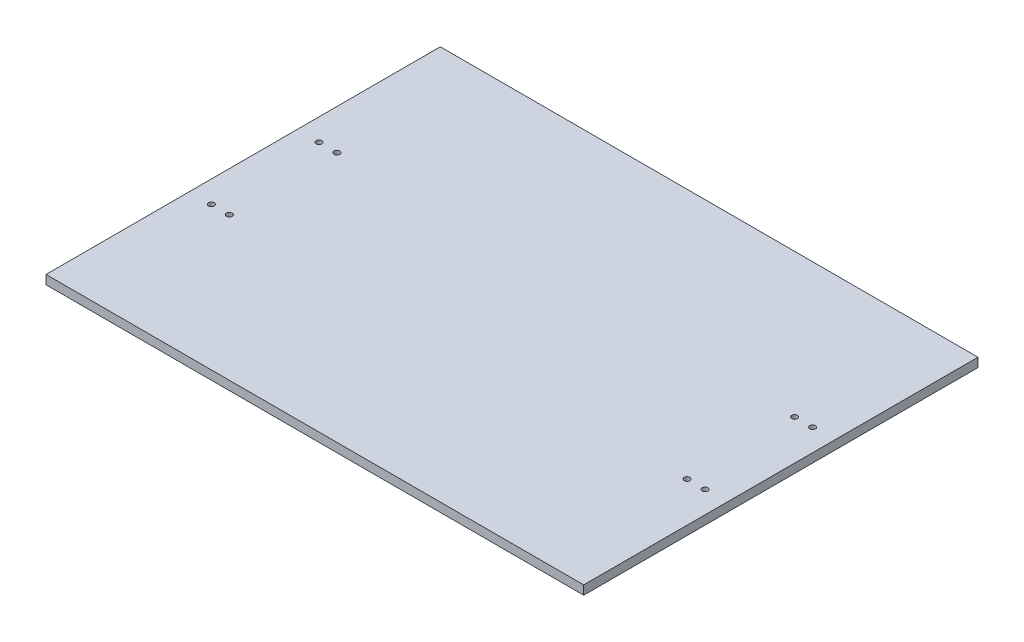
ISO-10303-21;
HEADER;
FILE_DESCRIPTION(('STEP AP214'),'2;1');
FILE_NAME('part.step','',(''),(''),'','','');
FILE_SCHEMA(('AUTOMOTIVE_DESIGN { 1 0 10303 214 1 1 1 1 }'));
ENDSEC;
DATA;
#1=APPLICATION_CONTEXT('core data for automotive mechanical design processes');
#2=APPLICATION_PROTOCOL_DEFINITION('international standard','automotive_design',2000,#1);
#3=PRODUCT_CONTEXT('',#1,'mechanical');
#4=PRODUCT('Part','Part','',(#3));
#5=PRODUCT_RELATED_PRODUCT_CATEGORY('part','',(#4));
#6=PRODUCT_DEFINITION_FORMATION('','',#4);
#7=PRODUCT_DEFINITION_CONTEXT('part definition',#1,'design');
#8=PRODUCT_DEFINITION('design','',#6,#7);
#9=PRODUCT_DEFINITION_SHAPE('','',#8);
#10=(LENGTH_UNIT() NAMED_UNIT(*) SI_UNIT(.MILLI.,.METRE.));
#11=(NAMED_UNIT(*) PLANE_ANGLE_UNIT() SI_UNIT($,.RADIAN.));
#12=(NAMED_UNIT(*) SI_UNIT($,.STERADIAN.) SOLID_ANGLE_UNIT());
#13=UNCERTAINTY_MEASURE_WITH_UNIT(LENGTH_MEASURE(1.E-05),#10,'distance_accuracy_value','');
#14=(GEOMETRIC_REPRESENTATION_CONTEXT(3) GLOBAL_UNCERTAINTY_ASSIGNED_CONTEXT((#13)) GLOBAL_UNIT_ASSIGNED_CONTEXT((#10,
#11,#12)) REPRESENTATION_CONTEXT('',''));
#15=CARTESIAN_POINT('',(0.,0.,0.));
#16=DIRECTION('',(0.,0.,1.));
#17=DIRECTION('',(1.,0.,0.));
#18=AXIS2_PLACEMENT_3D('',#15,#16,#17);
#19=CARTESIAN_POINT('',(-150.,5.,-110.));
#20=DIRECTION('',(1.,0.,0.));
#21=DIRECTION('',(0.,0.,-1.));
#22=AXIS2_PLACEMENT_3D('',#19,#20,#21);
#23=PLANE('',#22);
#24=DIRECTION('',(0.,0.,1.));
#25=VECTOR('',#24,1.);
#26=CARTESIAN_POINT('',(-150.,0.,-110.));
#27=LINE('',#26,#25);
#28=CARTESIAN_POINT('',(-150.,0.,-110.));
#29=VERTEX_POINT('',#28);
#30=CARTESIAN_POINT('',(-150.,0.,110.));
#31=VERTEX_POINT('',#30);
#32=EDGE_CURVE('E100',#29,#31,#27,.T.);
#33=ORIENTED_EDGE('',*,*,#32,.T.);
#34=DIRECTION('',(0.,-1.,0.));
#35=VECTOR('',#34,1.);
#36=CARTESIAN_POINT('',(-150.,5.,110.));
#37=LINE('',#36,#35);
#38=CARTESIAN_POINT('',(-150.,5.,110.));
#39=VERTEX_POINT('',#38);
#40=EDGE_CURVE('E11',#39,#31,#37,.T.);
#41=ORIENTED_EDGE('',*,*,#40,.F.);
#42=DIRECTION('',(0.,0.,1.));
#43=VECTOR('',#42,1.);
#44=CARTESIAN_POINT('',(-150.,5.,-110.));
#45=LINE('',#44,#43);
#46=CARTESIAN_POINT('',(-150.,5.,-110.));
#47=VERTEX_POINT('',#46);
#48=EDGE_CURVE('E88',#47,#39,#45,.T.);
#49=ORIENTED_EDGE('',*,*,#48,.F.);
#50=DIRECTION('',(0.,-1.,0.));
#51=VECTOR('',#50,1.);
#52=CARTESIAN_POINT('',(-150.,5.,-110.));
#53=LINE('',#52,#51);
#54=EDGE_CURVE('E96',#47,#29,#53,.T.);
#55=ORIENTED_EDGE('',*,*,#54,.T.);
#56=EDGE_LOOP('',(#33,#41,#49,#55));
#57=FACE_BOUND('',#56,.T.);
#58=ADVANCED_FACE('F37',(#57),#23,.F.);
#59=CARTESIAN_POINT('',(-150.,5.,110.));
#60=DIRECTION('',(0.,0.,-1.));
#61=DIRECTION('',(-1.,0.,0.));
#62=AXIS2_PLACEMENT_3D('',#59,#60,#61);
#63=PLANE('',#62);
#64=DIRECTION('',(1.,0.,0.));
#65=VECTOR('',#64,1.);
#66=CARTESIAN_POINT('',(-150.,0.,110.));
#67=LINE('',#66,#65);
#68=CARTESIAN_POINT('',(150.,0.,110.));
#69=VERTEX_POINT('',#68);
#70=EDGE_CURVE('E92',#31,#69,#67,.T.);
#71=ORIENTED_EDGE('',*,*,#70,.T.);
#72=DIRECTION('',(0.,-1.,0.));
#73=VECTOR('',#72,1.);
#74=CARTESIAN_POINT('',(150.,5.,110.));
#75=LINE('',#74,#73);
#76=CARTESIAN_POINT('',(150.,5.,110.));
#77=VERTEX_POINT('',#76);
#78=EDGE_CURVE('E45',#77,#69,#75,.T.);
#79=ORIENTED_EDGE('',*,*,#78,.F.);
#80=DIRECTION('',(1.,0.,0.));
#81=VECTOR('',#80,1.);
#82=CARTESIAN_POINT('',(-150.,5.,110.));
#83=LINE('',#82,#81);
#84=EDGE_CURVE('E83',#39,#77,#83,.T.);
#85=ORIENTED_EDGE('',*,*,#84,.F.);
#86=ORIENTED_EDGE('',*,*,#40,.T.);
#87=EDGE_LOOP('',(#71,#79,#85,#86));
#88=FACE_BOUND('',#87,.T.);
#89=ADVANCED_FACE('F91',(#88),#63,.F.);
#90=CARTESIAN_POINT('',(150.,5.,-110.));
#91=DIRECTION('',(-1.,0.,0.));
#92=DIRECTION('',(0.,0.,1.));
#93=AXIS2_PLACEMENT_3D('',#90,#91,#92);
#94=PLANE('',#93);
#95=DIRECTION('',(0.,0.,-1.));
#96=VECTOR('',#95,1.);
#97=CARTESIAN_POINT('',(150.,0.,-110.));
#98=LINE('',#97,#96);
#99=CARTESIAN_POINT('',(150.,0.,-110.));
#100=VERTEX_POINT('',#99);
#101=EDGE_CURVE('E70',#69,#100,#98,.T.);
#102=ORIENTED_EDGE('',*,*,#101,.T.);
#103=DIRECTION('',(0.,-1.,0.));
#104=VECTOR('',#103,1.);
#105=CARTESIAN_POINT('',(150.,5.,-110.));
#106=LINE('',#105,#104);
#107=CARTESIAN_POINT('',(150.,5.,-110.));
#108=VERTEX_POINT('',#107);
#109=EDGE_CURVE('E93',#108,#100,#106,.T.);
#110=ORIENTED_EDGE('',*,*,#109,.F.);
#111=DIRECTION('',(0.,0.,-1.));
#112=VECTOR('',#111,1.);
#113=CARTESIAN_POINT('',(150.,5.,-110.));
#114=LINE('',#113,#112);
#115=EDGE_CURVE('E86',#77,#108,#114,.T.);
#116=ORIENTED_EDGE('',*,*,#115,.F.);
#117=ORIENTED_EDGE('',*,*,#78,.T.);
#118=EDGE_LOOP('',(#102,#110,#116,#117));
#119=FACE_BOUND('',#118,.T.);
#120=ADVANCED_FACE('F94',(#119),#94,.F.);
#121=CARTESIAN_POINT('',(-150.,5.,-110.));
#122=DIRECTION('',(0.,0.,1.));
#123=DIRECTION('',(1.,0.,0.));
#124=AXIS2_PLACEMENT_3D('',#121,#122,#123);
#125=PLANE('',#124);
#126=DIRECTION('',(-1.,0.,0.));
#127=VECTOR('',#126,1.);
#128=CARTESIAN_POINT('',(-150.,0.,-110.));
#129=LINE('',#128,#127);
#130=EDGE_CURVE('E76',#100,#29,#129,.T.);
#131=ORIENTED_EDGE('',*,*,#130,.T.);
#132=ORIENTED_EDGE('',*,*,#54,.F.);
#133=DIRECTION('',(-1.,0.,0.));
#134=VECTOR('',#133,1.);
#135=CARTESIAN_POINT('',(-150.,5.,-110.));
#136=LINE('',#135,#134);
#137=EDGE_CURVE('E53',#108,#47,#136,.T.);
#138=ORIENTED_EDGE('',*,*,#137,.F.);
#139=ORIENTED_EDGE('',*,*,#109,.T.);
#140=EDGE_LOOP('',(#131,#132,#138,#139));
#141=FACE_BOUND('',#140,.T.);
#142=ADVANCED_FACE('F108',(#141),#125,.F.);
#143=CARTESIAN_POINT('',(0.,5.,0.));
#144=DIRECTION('',(0.,1.,0.));
#145=DIRECTION('',(0.,0.,1.));
#146=AXIS2_PLACEMENT_3D('',#143,#144,#145);
#147=PLANE('',#146);
#148=CARTESIAN_POINT('',(137.7,5.,30.));
#149=DIRECTION('',(0.,1.,0.));
#150=DIRECTION('',(0.,0.,1.));
#151=AXIS2_PLACEMENT_3D('',#148,#149,#150);
#152=CIRCLE('',#151,1.59999999999999);
#153=CARTESIAN_POINT('',(137.7,5.,31.6));
#154=VERTEX_POINT('',#153);
#155=EDGE_CURVE('E103',#154,#154,#152,.T.);
#156=ORIENTED_EDGE('',*,*,#155,.F.);
#157=EDGE_LOOP('',(#156));
#158=FACE_BOUND('',#157,.T.);
#159=CARTESIAN_POINT('',(-127.7,5.,30.));
#160=DIRECTION('',(0.,1.,0.));
#161=DIRECTION('',(0.,0.,1.));
#162=AXIS2_PLACEMENT_3D('',#159,#160,#161);
#163=CIRCLE('',#162,1.60000000000002);
#164=CARTESIAN_POINT('',(-127.7,5.,31.6));
#165=VERTEX_POINT('',#164);
#166=EDGE_CURVE('E116',#165,#165,#163,.T.);
#167=ORIENTED_EDGE('',*,*,#166,.F.);
#168=EDGE_LOOP('',(#167));
#169=FACE_BOUND('',#168,.T.);
#170=CARTESIAN_POINT('',(-137.7,5.,30.));
#171=DIRECTION('',(0.,1.,0.));
#172=DIRECTION('',(0.,0.,1.));
#173=AXIS2_PLACEMENT_3D('',#170,#171,#172);
#174=CIRCLE('',#173,1.60000000000002);
#175=CARTESIAN_POINT('',(-137.7,5.,31.6));
#176=VERTEX_POINT('',#175);
#177=EDGE_CURVE('E119',#176,#176,#174,.T.);
#178=ORIENTED_EDGE('',*,*,#177,.F.);
#179=EDGE_LOOP('',(#178));
#180=FACE_BOUND('',#179,.T.);
#181=CARTESIAN_POINT('',(-127.7,5.,-30.));
#182=DIRECTION('',(0.,1.,0.));
#183=DIRECTION('',(0.,0.,1.));
#184=AXIS2_PLACEMENT_3D('',#181,#182,#183);
#185=CIRCLE('',#184,1.60000000000002);
#186=CARTESIAN_POINT('',(-127.7,5.,-28.4));
#187=VERTEX_POINT('',#186);
#188=EDGE_CURVE('E122',#187,#187,#185,.T.);
#189=ORIENTED_EDGE('',*,*,#188,.F.);
#190=EDGE_LOOP('',(#189));
#191=FACE_BOUND('',#190,.T.);
#192=CARTESIAN_POINT('',(137.7,5.,-30.));
#193=DIRECTION('',(0.,1.,0.));
#194=DIRECTION('',(0.,0.,1.));
#195=AXIS2_PLACEMENT_3D('',#192,#193,#194);
#196=CIRCLE('',#195,1.59999999999999);
#197=CARTESIAN_POINT('',(137.7,5.,-28.4));
#198=VERTEX_POINT('',#197);
#199=EDGE_CURVE('E125',#198,#198,#196,.T.);
#200=ORIENTED_EDGE('',*,*,#199,.F.);
#201=EDGE_LOOP('',(#200));
#202=FACE_BOUND('',#201,.T.);
#203=CARTESIAN_POINT('',(127.7,5.,-30.));
#204=DIRECTION('',(0.,1.,0.));
#205=DIRECTION('',(0.,0.,1.));
#206=AXIS2_PLACEMENT_3D('',#203,#204,#205);
#207=CIRCLE('',#206,1.60000000000002);
#208=CARTESIAN_POINT('',(127.7,5.,-28.4));
#209=VERTEX_POINT('',#208);
#210=EDGE_CURVE('E128',#209,#209,#207,.T.);
#211=ORIENTED_EDGE('',*,*,#210,.F.);
#212=EDGE_LOOP('',(#211));
#213=FACE_BOUND('',#212,.T.);
#214=CARTESIAN_POINT('',(127.7,5.,30.));
#215=DIRECTION('',(0.,1.,0.));
#216=DIRECTION('',(0.,0.,1.));
#217=AXIS2_PLACEMENT_3D('',#214,#215,#216);
#218=CIRCLE('',#217,1.60000000000002);
#219=CARTESIAN_POINT('',(127.7,5.,31.6));
#220=VERTEX_POINT('',#219);
#221=EDGE_CURVE('E131',#220,#220,#218,.T.);
#222=ORIENTED_EDGE('',*,*,#221,.F.);
#223=EDGE_LOOP('',(#222));
#224=FACE_BOUND('',#223,.T.);
#225=CARTESIAN_POINT('',(-137.7,5.,-30.));
#226=DIRECTION('',(0.,1.,0.));
#227=DIRECTION('',(0.,0.,1.));
#228=AXIS2_PLACEMENT_3D('',#225,#226,#227);
#229=CIRCLE('',#228,1.60000000000002);
#230=CARTESIAN_POINT('',(-137.7,5.,-28.4));
#231=VERTEX_POINT('',#230);
#232=EDGE_CURVE('E134',#231,#231,#229,.T.);
#233=ORIENTED_EDGE('',*,*,#232,.F.);
#234=EDGE_LOOP('',(#233));
#235=FACE_BOUND('',#234,.T.);
#236=ORIENTED_EDGE('',*,*,#48,.T.);
#237=ORIENTED_EDGE('',*,*,#84,.T.);
#238=ORIENTED_EDGE('',*,*,#115,.T.);
#239=ORIENTED_EDGE('',*,*,#137,.T.);
#240=EDGE_LOOP('',(#236,#237,#238,#239));
#241=FACE_BOUND('',#240,.T.);
#242=ADVANCED_FACE('F84',(#158,#169,#180,#191,#202,#213,#224,#235,#241),#147,.T.);
#243=CARTESIAN_POINT('',(0.,0.,0.));
#244=DIRECTION('',(0.,1.,0.));
#245=DIRECTION('',(0.,0.,1.));
#246=AXIS2_PLACEMENT_3D('',#243,#244,#245);
#247=PLANE('',#246);
#248=CARTESIAN_POINT('',(137.7,0.,30.));
#249=DIRECTION('',(0.,-1.,0.));
#250=DIRECTION('',(0.,0.,-1.));
#251=AXIS2_PLACEMENT_3D('',#248,#249,#250);
#252=CIRCLE('',#251,1.59999999999999);
#253=CARTESIAN_POINT('',(137.7,0.,28.4));
#254=VERTEX_POINT('',#253);
#255=EDGE_CURVE('E147',#254,#254,#252,.T.);
#256=ORIENTED_EDGE('',*,*,#255,.F.);
#257=EDGE_LOOP('',(#256));
#258=FACE_BOUND('',#257,.T.);
#259=CARTESIAN_POINT('',(-127.7,0.,30.));
#260=DIRECTION('',(0.,-1.,0.));
#261=DIRECTION('',(0.,0.,-1.));
#262=AXIS2_PLACEMENT_3D('',#259,#260,#261);
#263=CIRCLE('',#262,1.60000000000002);
#264=CARTESIAN_POINT('',(-127.7,0.,28.4));
#265=VERTEX_POINT('',#264);
#266=EDGE_CURVE('E144',#265,#265,#263,.T.);
#267=ORIENTED_EDGE('',*,*,#266,.F.);
#268=EDGE_LOOP('',(#267));
#269=FACE_BOUND('',#268,.T.);
#270=CARTESIAN_POINT('',(-137.7,0.,30.));
#271=DIRECTION('',(0.,-1.,0.));
#272=DIRECTION('',(0.,0.,-1.));
#273=AXIS2_PLACEMENT_3D('',#270,#271,#272);
#274=CIRCLE('',#273,1.60000000000002);
#275=CARTESIAN_POINT('',(-137.7,0.,28.4));
#276=VERTEX_POINT('',#275);
#277=EDGE_CURVE('E141',#276,#276,#274,.T.);
#278=ORIENTED_EDGE('',*,*,#277,.F.);
#279=EDGE_LOOP('',(#278));
#280=FACE_BOUND('',#279,.T.);
#281=CARTESIAN_POINT('',(-127.7,0.,-30.));
#282=DIRECTION('',(0.,-1.,0.));
#283=DIRECTION('',(0.,0.,-1.));
#284=AXIS2_PLACEMENT_3D('',#281,#282,#283);
#285=CIRCLE('',#284,1.60000000000002);
#286=CARTESIAN_POINT('',(-127.7,0.,-31.6));
#287=VERTEX_POINT('',#286);
#288=EDGE_CURVE('E140',#287,#287,#285,.T.);
#289=ORIENTED_EDGE('',*,*,#288,.F.);
#290=EDGE_LOOP('',(#289));
#291=FACE_BOUND('',#290,.T.);
#292=CARTESIAN_POINT('',(137.7,0.,-30.));
#293=DIRECTION('',(0.,-1.,0.));
#294=DIRECTION('',(0.,0.,-1.));
#295=AXIS2_PLACEMENT_3D('',#292,#293,#294);
#296=CIRCLE('',#295,1.59999999999999);
#297=CARTESIAN_POINT('',(137.7,0.,-31.6));
#298=VERTEX_POINT('',#297);
#299=EDGE_CURVE('E150',#298,#298,#296,.T.);
#300=ORIENTED_EDGE('',*,*,#299,.F.);
#301=EDGE_LOOP('',(#300));
#302=FACE_BOUND('',#301,.T.);
#303=CARTESIAN_POINT('',(127.7,0.,-30.));
#304=DIRECTION('',(0.,-1.,0.));
#305=DIRECTION('',(0.,0.,-1.));
#306=AXIS2_PLACEMENT_3D('',#303,#304,#305);
#307=CIRCLE('',#306,1.60000000000002);
#308=CARTESIAN_POINT('',(127.7,0.,-31.6));
#309=VERTEX_POINT('',#308);
#310=EDGE_CURVE('E156',#309,#309,#307,.T.);
#311=ORIENTED_EDGE('',*,*,#310,.F.);
#312=EDGE_LOOP('',(#311));
#313=FACE_BOUND('',#312,.T.);
#314=CARTESIAN_POINT('',(127.7,0.,30.));
#315=DIRECTION('',(0.,-1.,0.));
#316=DIRECTION('',(0.,0.,-1.));
#317=AXIS2_PLACEMENT_3D('',#314,#315,#316);
#318=CIRCLE('',#317,1.60000000000002);
#319=CARTESIAN_POINT('',(127.7,0.,28.4));
#320=VERTEX_POINT('',#319);
#321=EDGE_CURVE('E153',#320,#320,#318,.T.);
#322=ORIENTED_EDGE('',*,*,#321,.F.);
#323=EDGE_LOOP('',(#322));
#324=FACE_BOUND('',#323,.T.);
#325=CARTESIAN_POINT('',(-137.7,0.,-30.));
#326=DIRECTION('',(0.,-1.,0.));
#327=DIRECTION('',(0.,0.,-1.));
#328=AXIS2_PLACEMENT_3D('',#325,#326,#327);
#329=CIRCLE('',#328,1.60000000000002);
#330=CARTESIAN_POINT('',(-137.7,0.,-31.6));
#331=VERTEX_POINT('',#330);
#332=EDGE_CURVE('E137',#331,#331,#329,.T.);
#333=ORIENTED_EDGE('',*,*,#332,.F.);
#334=EDGE_LOOP('',(#333));
#335=FACE_BOUND('',#334,.T.);
#336=ORIENTED_EDGE('',*,*,#32,.F.);
#337=ORIENTED_EDGE('',*,*,#130,.F.);
#338=ORIENTED_EDGE('',*,*,#101,.F.);
#339=ORIENTED_EDGE('',*,*,#70,.F.);
#340=EDGE_LOOP('',(#336,#337,#338,#339));
#341=FACE_BOUND('',#340,.T.);
#342=ADVANCED_FACE('F111',(#258,#269,#280,#291,#302,#313,#324,#335,#341),#247,.F.);
#343=CARTESIAN_POINT('',(-137.7,10.,-30.));
#344=DIRECTION('',(0.,-1.,0.));
#345=DIRECTION('',(0.,0.,-1.));
#346=AXIS2_PLACEMENT_3D('',#343,#344,#345);
#347=CYLINDRICAL_SURFACE('',#346,1.60000000000002);
#348=ORIENTED_EDGE('',*,*,#232,.T.);
#349=EDGE_LOOP('',(#348));
#350=FACE_BOUND('',#349,.T.);
#351=ORIENTED_EDGE('',*,*,#332,.T.);
#352=EDGE_LOOP('',(#351));
#353=FACE_BOUND('',#352,.T.);
#354=ADVANCED_FACE('F166',(#350,#353),#347,.F.);
#355=CARTESIAN_POINT('',(127.7,10.,30.));
#356=DIRECTION('',(0.,-1.,0.));
#357=DIRECTION('',(0.,0.,-1.));
#358=AXIS2_PLACEMENT_3D('',#355,#356,#357);
#359=CYLINDRICAL_SURFACE('',#358,1.60000000000002);
#360=ORIENTED_EDGE('',*,*,#221,.T.);
#361=EDGE_LOOP('',(#360));
#362=FACE_BOUND('',#361,.T.);
#363=ORIENTED_EDGE('',*,*,#321,.T.);
#364=EDGE_LOOP('',(#363));
#365=FACE_BOUND('',#364,.T.);
#366=ADVANCED_FACE('F176',(#362,#365),#359,.F.);
#367=CARTESIAN_POINT('',(127.7,10.,-30.));
#368=DIRECTION('',(0.,-1.,0.));
#369=DIRECTION('',(0.,0.,-1.));
#370=AXIS2_PLACEMENT_3D('',#367,#368,#369);
#371=CYLINDRICAL_SURFACE('',#370,1.60000000000002);
#372=ORIENTED_EDGE('',*,*,#210,.T.);
#373=EDGE_LOOP('',(#372));
#374=FACE_BOUND('',#373,.T.);
#375=ORIENTED_EDGE('',*,*,#310,.T.);
#376=EDGE_LOOP('',(#375));
#377=FACE_BOUND('',#376,.T.);
#378=ADVANCED_FACE('F183',(#374,#377),#371,.F.);
#379=CARTESIAN_POINT('',(137.7,10.,-30.));
#380=DIRECTION('',(0.,-1.,0.));
#381=DIRECTION('',(0.,0.,-1.));
#382=AXIS2_PLACEMENT_3D('',#379,#380,#381);
#383=CYLINDRICAL_SURFACE('',#382,1.59999999999999);
#384=ORIENTED_EDGE('',*,*,#199,.T.);
#385=EDGE_LOOP('',(#384));
#386=FACE_BOUND('',#385,.T.);
#387=ORIENTED_EDGE('',*,*,#299,.T.);
#388=EDGE_LOOP('',(#387));
#389=FACE_BOUND('',#388,.T.);
#390=ADVANCED_FACE('F162',(#386,#389),#383,.F.);
#391=CARTESIAN_POINT('',(-127.7,10.,-30.));
#392=DIRECTION('',(0.,-1.,0.));
#393=DIRECTION('',(0.,0.,-1.));
#394=AXIS2_PLACEMENT_3D('',#391,#392,#393);
#395=CYLINDRICAL_SURFACE('',#394,1.60000000000002);
#396=ORIENTED_EDGE('',*,*,#188,.T.);
#397=EDGE_LOOP('',(#396));
#398=FACE_BOUND('',#397,.T.);
#399=ORIENTED_EDGE('',*,*,#288,.T.);
#400=EDGE_LOOP('',(#399));
#401=FACE_BOUND('',#400,.T.);
#402=ADVANCED_FACE('F226',(#398,#401),#395,.F.);
#403=CARTESIAN_POINT('',(-137.7,10.,30.));
#404=DIRECTION('',(0.,-1.,0.));
#405=DIRECTION('',(0.,0.,-1.));
#406=AXIS2_PLACEMENT_3D('',#403,#404,#405);
#407=CYLINDRICAL_SURFACE('',#406,1.60000000000002);
#408=ORIENTED_EDGE('',*,*,#177,.T.);
#409=EDGE_LOOP('',(#408));
#410=FACE_BOUND('',#409,.T.);
#411=ORIENTED_EDGE('',*,*,#277,.T.);
#412=EDGE_LOOP('',(#411));
#413=FACE_BOUND('',#412,.T.);
#414=ADVANCED_FACE('F234',(#410,#413),#407,.F.);
#415=CARTESIAN_POINT('',(-127.7,10.,30.));
#416=DIRECTION('',(0.,-1.,0.));
#417=DIRECTION('',(0.,0.,-1.));
#418=AXIS2_PLACEMENT_3D('',#415,#416,#417);
#419=CYLINDRICAL_SURFACE('',#418,1.60000000000002);
#420=ORIENTED_EDGE('',*,*,#166,.T.);
#421=EDGE_LOOP('',(#420));
#422=FACE_BOUND('',#421,.T.);
#423=ORIENTED_EDGE('',*,*,#266,.T.);
#424=EDGE_LOOP('',(#423));
#425=FACE_BOUND('',#424,.T.);
#426=ADVANCED_FACE('F230',(#422,#425),#419,.F.);
#427=CARTESIAN_POINT('',(137.7,10.,30.));
#428=DIRECTION('',(0.,-1.,0.));
#429=DIRECTION('',(0.,0.,-1.));
#430=AXIS2_PLACEMENT_3D('',#427,#428,#429);
#431=CYLINDRICAL_SURFACE('',#430,1.59999999999999);
#432=ORIENTED_EDGE('',*,*,#155,.T.);
#433=EDGE_LOOP('',(#432));
#434=FACE_BOUND('',#433,.T.);
#435=ORIENTED_EDGE('',*,*,#255,.T.);
#436=EDGE_LOOP('',(#435));
#437=FACE_BOUND('',#436,.T.);
#438=ADVANCED_FACE('F233',(#434,#437),#431,.F.);
#439=CLOSED_SHELL('',(#58,#89,#120,#142,#242,#342,#354,#366,#378,#390,#402,#414,#426,#438));
#440=MANIFOLD_SOLID_BREP('B2',#439);
#441=ADVANCED_BREP_SHAPE_REPRESENTATION('',(#18,#440),#14);
#442=SHAPE_DEFINITION_REPRESENTATION(#9,#441);
ENDSEC;
END-ISO-10303-21;
